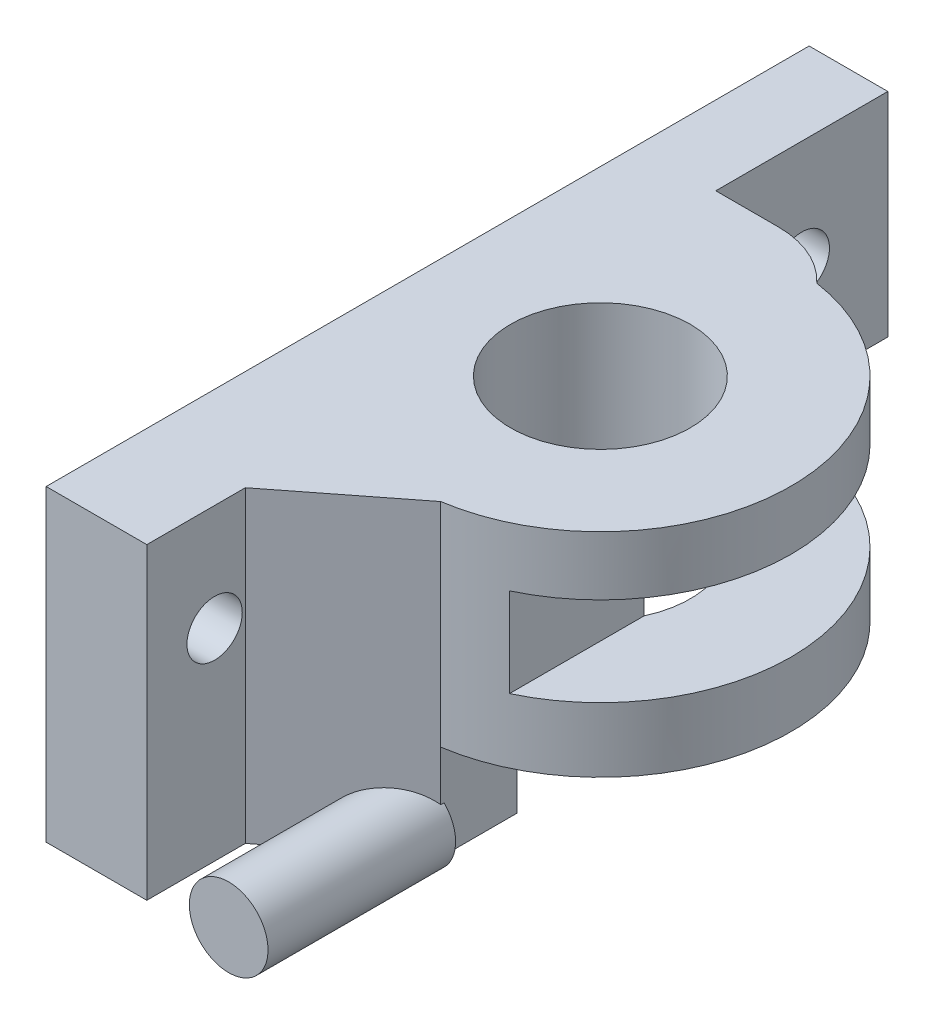
ISO-10303-21;
HEADER;
FILE_DESCRIPTION(('STEP AP214'),'2;1');
FILE_NAME('part.step','',(''),(''),'','','');
FILE_SCHEMA(('AUTOMOTIVE_DESIGN { 1 0 10303 214 1 1 1 1 }'));
ENDSEC;
DATA;
#1=APPLICATION_CONTEXT('core data for automotive mechanical design processes');
#2=APPLICATION_PROTOCOL_DEFINITION('international standard','automotive_design',2000,#1);
#3=PRODUCT_CONTEXT('',#1,'mechanical');
#4=PRODUCT('Part','Part','',(#3));
#5=PRODUCT_RELATED_PRODUCT_CATEGORY('part','',(#4));
#6=PRODUCT_DEFINITION_FORMATION('','',#4);
#7=PRODUCT_DEFINITION_CONTEXT('part definition',#1,'design');
#8=PRODUCT_DEFINITION('design','',#6,#7);
#9=PRODUCT_DEFINITION_SHAPE('','',#8);
#10=(LENGTH_UNIT() NAMED_UNIT(*) SI_UNIT(.MILLI.,.METRE.));
#11=(NAMED_UNIT(*) PLANE_ANGLE_UNIT() SI_UNIT($,.RADIAN.));
#12=(NAMED_UNIT(*) SI_UNIT($,.STERADIAN.) SOLID_ANGLE_UNIT());
#13=UNCERTAINTY_MEASURE_WITH_UNIT(LENGTH_MEASURE(1.E-05),#10,'distance_accuracy_value','');
#14=(GEOMETRIC_REPRESENTATION_CONTEXT(3) GLOBAL_UNCERTAINTY_ASSIGNED_CONTEXT((#13)) GLOBAL_UNIT_ASSIGNED_CONTEXT((#10,
#11,#12)) REPRESENTATION_CONTEXT('',''));
#15=CARTESIAN_POINT('',(0.,0.,0.));
#16=DIRECTION('',(0.,0.,1.));
#17=DIRECTION('',(1.,0.,0.));
#18=AXIS2_PLACEMENT_3D('',#15,#16,#17);
#19=CARTESIAN_POINT('',(-1.39148813039528,-11.785,-34.2));
#20=DIRECTION('',(0.,1.,0.));
#21=DIRECTION('',(0.,0.,1.));
#22=AXIS2_PLACEMENT_3D('',#19,#20,#21);
#23=PLANE('',#22);
#24=CARTESIAN_POINT('',(0.,-11.785,0.));
#25=DIRECTION('',(0.,-1.,0.));
#26=DIRECTION('',(0.,0.,-1.));
#27=AXIS2_PLACEMENT_3D('',#24,#25,#26);
#28=CIRCLE('',#27,9.7);
#29=CARTESIAN_POINT('',(0.,-11.785,-9.7));
#30=VERTEX_POINT('',#29);
#31=EDGE_CURVE('E275',#30,#30,#28,.T.);
#32=ORIENTED_EDGE('',*,*,#31,.F.);
#33=EDGE_LOOP('',(#32));
#34=FACE_BOUND('',#33,.T.);
#35=DIRECTION('',(0.,0.,1.));
#36=VECTOR('',#35,1.);
#37=CARTESIAN_POINT('',(3.10851186960473,-11.785,12.089639111871));
#38=LINE('',#37,#36);
#39=CARTESIAN_POINT('',(3.10851186960473,-11.785,12.089639111871));
#40=VERTEX_POINT('',#39);
#41=CARTESIAN_POINT('',(3.10851186960473,-11.785,20.3539984758898));
#42=VERTEX_POINT('',#41);
#43=EDGE_CURVE('E321',#40,#42,#38,.T.);
#44=ORIENTED_EDGE('',*,*,#43,.F.);
#45=DIRECTION('',(1.,0.,0.));
#46=VECTOR('',#45,1.);
#47=CARTESIAN_POINT('',(-19.6,-11.785,12.089639111871));
#48=LINE('',#47,#46);
#49=CARTESIAN_POINT('',(-19.6,-11.785,12.089639111871));
#50=VERTEX_POINT('',#49);
#51=EDGE_CURVE('E324',#50,#40,#48,.T.);
#52=ORIENTED_EDGE('',*,*,#51,.F.);
#53=DIRECTION('',(0.,0.,1.));
#54=VECTOR('',#53,1.);
#55=CARTESIAN_POINT('',(-19.6,-11.785,-42.1394874741397));
#56=LINE('',#55,#54);
#57=CARTESIAN_POINT('',(-19.6,-11.785,-42.1394874741397));
#58=VERTEX_POINT('',#57);
#59=EDGE_CURVE('E216',#58,#50,#56,.T.);
#60=ORIENTED_EDGE('',*,*,#59,.F.);
#61=DIRECTION('',(1.,0.,0.));
#62=VECTOR('',#61,1.);
#63=CARTESIAN_POINT('',(-14.6,-11.785,-42.1394874741397));
#64=LINE('',#63,#62);
#65=CARTESIAN_POINT('',(-11.1,-11.785,-42.1394874741397));
#66=VERTEX_POINT('',#65);
#67=EDGE_CURVE('E223',#58,#66,#64,.T.);
#68=ORIENTED_EDGE('',*,*,#67,.T.);
#69=DIRECTION('',(0.,0.,1.));
#70=VECTOR('',#69,1.);
#71=CARTESIAN_POINT('',(-11.1,-11.785,-36.510780817625));
#72=LINE('',#71,#70);
#73=CARTESIAN_POINT('',(-11.1,-11.785,-23.5594874741397));
#74=VERTEX_POINT('',#73);
#75=EDGE_CURVE('E233',#66,#74,#72,.T.);
#76=ORIENTED_EDGE('',*,*,#75,.T.);
#77=DIRECTION('',(-1.,0.,0.));
#78=VECTOR('',#77,1.);
#79=CARTESIAN_POINT('',(3.00000000000002,-11.785,-23.5594874741397));
#80=LINE('',#79,#78);
#81=CARTESIAN_POINT('',(-4.32210177975512,-11.785,-23.5594874741397));
#82=VERTEX_POINT('',#81);
#83=EDGE_CURVE('E236',#82,#74,#80,.T.);
#84=ORIENTED_EDGE('',*,*,#83,.F.);
#85=CARTESIAN_POINT('',(-4.32210177975512,-11.785,-13.5594874741397));
#86=DIRECTION('',(0.,1.,0.));
#87=DIRECTION('',(0.,0.,1.));
#88=AXIS2_PLACEMENT_3D('',#85,#86,#87);
#89=CIRCLE('',#88,10.);
#90=CARTESIAN_POINT('',(3.00000000000002,-11.785,-20.3702749122342));
#91=VERTEX_POINT('',#90);
#92=EDGE_CURVE('E229',#82,#91,#89,.F.);
#93=ORIENTED_EDGE('',*,*,#92,.T.);
#94=CARTESIAN_POINT('',(0.,-11.785,0.));
#95=DIRECTION('',(0.,1.,0.));
#96=DIRECTION('',(0.,0.,1.));
#97=AXIS2_PLACEMENT_3D('',#94,#95,#96);
#98=CIRCLE('',#97,20.59);
#99=EDGE_CURVE('E249',#42,#91,#98,.T.);
#100=ORIENTED_EDGE('',*,*,#99,.F.);
#101=EDGE_LOOP('',(#44,#52,#60,#68,#76,#84,#93,#100));
#102=FACE_BOUND('',#101,.T.);
#103=ADVANCED_FACE('F55',(#34,#102),#23,.F.);
#104=CARTESIAN_POINT('',(0.,-55.2,0.));
#105=DIRECTION('',(0.,1.,0.));
#106=DIRECTION('',(0.,0.,1.));
#107=AXIS2_PLACEMENT_3D('',#104,#105,#106);
#108=CYLINDRICAL_SURFACE('',#107,20.59);
#109=CARTESIAN_POINT('',(0.,4.80402203282774,0.));
#110=DIRECTION('',(0.,1.,0.));
#111=DIRECTION('',(0.,0.,1.));
#112=AXIS2_PLACEMENT_3D('',#109,#110,#111);
#113=CIRCLE('',#112,20.59);
#114=CARTESIAN_POINT('',(8.80000000000003,4.80402203282774,18.6147280399151));
#115=VERTEX_POINT('',#114);
#116=CARTESIAN_POINT('',(8.80000000000003,4.80402203282774,-18.6147280399151));
#117=VERTEX_POINT('',#116);
#118=EDGE_CURVE('E254',#115,#117,#113,.T.);
#119=ORIENTED_EDGE('',*,*,#118,.T.);
#120=DIRECTION('',(0.,1.,0.));
#121=VECTOR('',#120,1.);
#122=CARTESIAN_POINT('',(8.80000000000003,-55.2,-18.614728039915));
#123=LINE('',#122,#121);
#124=CARTESIAN_POINT('',(8.80000000000003,-4.80402203282774,-18.614728039915));
#125=VERTEX_POINT('',#124);
#126=EDGE_CURVE('E255',#125,#117,#123,.T.);
#127=ORIENTED_EDGE('',*,*,#126,.F.);
#128=CARTESIAN_POINT('',(0.,-4.80402203282775,0.));
#129=DIRECTION('',(0.,-1.,0.));
#130=DIRECTION('',(0.,0.,-1.));
#131=AXIS2_PLACEMENT_3D('',#128,#129,#130);
#132=CIRCLE('',#131,20.59);
#133=CARTESIAN_POINT('',(8.80000000000003,-4.80402203282774,18.614728039915));
#134=VERTEX_POINT('',#133);
#135=EDGE_CURVE('E251',#125,#134,#132,.T.);
#136=ORIENTED_EDGE('',*,*,#135,.T.);
#137=DIRECTION('',(0.,1.,0.));
#138=VECTOR('',#137,1.);
#139=CARTESIAN_POINT('',(8.80000000000003,-55.2,18.614728039915));
#140=LINE('',#139,#138);
#141=EDGE_CURVE('E258',#115,#134,#140,.F.);
#142=ORIENTED_EDGE('',*,*,#141,.F.);
#143=EDGE_LOOP('',(#119,#127,#136,#142));
#144=FACE_BOUND('',#143,.T.);
#145=DIRECTION('',(0.,1.,0.));
#146=VECTOR('',#145,1.);
#147=CARTESIAN_POINT('',(3.10851186960473,-55.2,20.3539984758898));
#148=LINE('',#147,#146);
#149=CARTESIAN_POINT('',(3.10851186960473,11.1805911601393,20.3539984758898));
#150=VERTEX_POINT('',#149);
#151=EDGE_CURVE('E243',#42,#150,#148,.T.);
#152=ORIENTED_EDGE('',*,*,#151,.F.);
#153=ORIENTED_EDGE('',*,*,#99,.T.);
#154=DIRECTION('',(0.,1.,0.));
#155=VECTOR('',#154,1.);
#156=CARTESIAN_POINT('',(3.00000000000003,-55.2,-20.3702749122342));
#157=LINE('',#156,#155);
#158=CARTESIAN_POINT('',(3.00000000000002,11.1805911601393,-20.3702749122343));
#159=VERTEX_POINT('',#158);
#160=EDGE_CURVE('E248',#91,#159,#157,.T.);
#161=ORIENTED_EDGE('',*,*,#160,.T.);
#162=CARTESIAN_POINT('',(0.,11.1805911601393,0.));
#163=DIRECTION('',(0.,-1.,0.));
#164=DIRECTION('',(0.,0.,-1.));
#165=AXIS2_PLACEMENT_3D('',#162,#163,#164);
#166=CIRCLE('',#165,20.59);
#167=EDGE_CURVE('E244',#159,#150,#166,.T.);
#168=ORIENTED_EDGE('',*,*,#167,.T.);
#169=EDGE_LOOP('',(#152,#153,#161,#168));
#170=FACE_BOUND('',#169,.T.);
#171=ADVANCED_FACE('F345',(#144,#170),#108,.T.);
#172=CARTESIAN_POINT('',(-16.2413436660295,11.1805911601393,-36.1));
#173=DIRECTION('',(0.,-1.,0.));
#174=DIRECTION('',(0.,0.,-1.));
#175=AXIS2_PLACEMENT_3D('',#172,#173,#174);
#176=PLANE('',#175);
#177=DIRECTION('',(0.,0.,-1.));
#178=VECTOR('',#177,1.);
#179=CARTESIAN_POINT('',(-19.6,11.1805911601393,-42.1394874741397));
#180=LINE('',#179,#178);
#181=CARTESIAN_POINT('',(-19.6,11.1805911601393,40.2493796193678));
#182=VERTEX_POINT('',#181);
#183=CARTESIAN_POINT('',(-19.6,11.1805911601393,-42.1394874741397));
#184=VERTEX_POINT('',#183);
#185=EDGE_CURVE('E192',#182,#184,#180,.T.);
#186=ORIENTED_EDGE('',*,*,#185,.F.);
#187=DIRECTION('',(-1.,0.,0.));
#188=VECTOR('',#187,1.);
#189=CARTESIAN_POINT('',(-21.4609176370796,11.1805911601393,40.2493796193678));
#190=LINE('',#189,#188);
#191=CARTESIAN_POINT('',(-8.73055199367073,11.1805911601393,40.2493796193678));
#192=VERTEX_POINT('',#191);
#193=EDGE_CURVE('E178',#192,#182,#190,.T.);
#194=ORIENTED_EDGE('',*,*,#193,.F.);
#195=DIRECTION('',(0.,0.,1.));
#196=VECTOR('',#195,1.);
#197=CARTESIAN_POINT('',(-8.73055199367072,11.1805911601393,29.6073390992279));
#198=LINE('',#197,#196);
#199=CARTESIAN_POINT('',(-8.73055199367072,11.1805911601393,29.6073390992279));
#200=VERTEX_POINT('',#199);
#201=EDGE_CURVE('E190',#200,#192,#198,.T.);
#202=ORIENTED_EDGE('',*,*,#201,.F.);
#203=DIRECTION('',(-0.787892886320469,0.,0.615812308813003));
#204=VECTOR('',#203,1.);
#205=CARTESIAN_POINT('',(3.10851186960473,11.1805911601393,20.3539984758898));
#206=LINE('',#205,#204);
#207=EDGE_CURVE('E199',#150,#200,#206,.T.);
#208=ORIENTED_EDGE('',*,*,#207,.F.);
#209=ORIENTED_EDGE('',*,*,#167,.F.);
#210=CARTESIAN_POINT('',(-4.32210177975512,11.1805911601393,-13.5594874741397));
#211=DIRECTION('',(0.,-1.,0.));
#212=DIRECTION('',(0.,0.,-1.));
#213=AXIS2_PLACEMENT_3D('',#210,#211,#212);
#214=CIRCLE('',#213,10.);
#215=CARTESIAN_POINT('',(-4.32210177975512,11.1805911601393,-23.5594874741397));
#216=VERTEX_POINT('',#215);
#217=EDGE_CURVE('E228',#159,#216,#214,.F.);
#218=ORIENTED_EDGE('',*,*,#217,.T.);
#219=DIRECTION('',(1.,0.,0.));
#220=VECTOR('',#219,1.);
#221=CARTESIAN_POINT('',(-16.1,11.1805911601393,-23.5594874741397));
#222=LINE('',#221,#220);
#223=CARTESIAN_POINT('',(-11.1,11.1805911601393,-23.5594874741397));
#224=VERTEX_POINT('',#223);
#225=EDGE_CURVE('E237',#224,#216,#222,.T.);
#226=ORIENTED_EDGE('',*,*,#225,.F.);
#227=DIRECTION('',(0.,0.,-1.));
#228=VECTOR('',#227,1.);
#229=CARTESIAN_POINT('',(-11.1,11.1805911601393,-42.1394874741397));
#230=LINE('',#229,#228);
#231=CARTESIAN_POINT('',(-11.1,11.1805911601393,-42.1394874741397));
#232=VERTEX_POINT('',#231);
#233=EDGE_CURVE('E221',#224,#232,#230,.T.);
#234=ORIENTED_EDGE('',*,*,#233,.T.);
#235=DIRECTION('',(-1.,0.,0.));
#236=VECTOR('',#235,1.);
#237=CARTESIAN_POINT('',(-14.6,11.1805911601393,-42.1394874741397));
#238=LINE('',#237,#236);
#239=EDGE_CURVE('E290',#232,#184,#238,.T.);
#240=ORIENTED_EDGE('',*,*,#239,.T.);
#241=EDGE_LOOP('',(#186,#194,#202,#208,#209,#218,#226,#234,#240));
#242=FACE_BOUND('',#241,.T.);
#243=CARTESIAN_POINT('',(0.,11.1805911601393,0.));
#244=DIRECTION('',(0.,-1.,0.));
#245=DIRECTION('',(0.,0.,-1.));
#246=AXIS2_PLACEMENT_3D('',#243,#244,#245);
#247=CIRCLE('',#246,9.7);
#248=CARTESIAN_POINT('',(0.,11.1805911601393,-9.7));
#249=VERTEX_POINT('',#248);
#250=EDGE_CURVE('E239',#249,#249,#247,.T.);
#251=ORIENTED_EDGE('',*,*,#250,.T.);
#252=EDGE_LOOP('',(#251));
#253=FACE_BOUND('',#252,.T.);
#254=ADVANCED_FACE('F57',(#242,#253),#176,.F.);
#255=CARTESIAN_POINT('',(8.80000000000003,4.80402203282774,22.440347469412));
#256=DIRECTION('',(0.,1.,0.));
#257=DIRECTION('',(0.,0.,1.));
#258=AXIS2_PLACEMENT_3D('',#255,#256,#257);
#259=PLANE('',#258);
#260=ORIENTED_EDGE('',*,*,#118,.F.);
#261=DIRECTION('',(0.,0.,1.));
#262=VECTOR('',#261,1.);
#263=CARTESIAN_POINT('',(8.80000000000003,4.80402203282774,22.440347469412));
#264=LINE('',#263,#262);
#265=CARTESIAN_POINT('',(8.80000000000003,4.80402203282774,4.08044115262057));
#266=VERTEX_POINT('',#265);
#267=EDGE_CURVE('E261',#266,#115,#264,.T.);
#268=ORIENTED_EDGE('',*,*,#267,.F.);
#269=CARTESIAN_POINT('',(0.,4.80402203282774,0.));
#270=DIRECTION('',(0.,1.,0.));
#271=DIRECTION('',(0.,0.,1.));
#272=AXIS2_PLACEMENT_3D('',#269,#270,#271);
#273=CIRCLE('',#272,9.7);
#274=CARTESIAN_POINT('',(8.80000000000003,4.80402203282774,-4.08044115262056));
#275=VERTEX_POINT('',#274);
#276=EDGE_CURVE('E232',#266,#275,#273,.T.);
#277=ORIENTED_EDGE('',*,*,#276,.T.);
#278=EDGE_CURVE('E257',#117,#275,#264,.T.);
#279=ORIENTED_EDGE('',*,*,#278,.F.);
#280=EDGE_LOOP('',(#260,#268,#277,#279));
#281=FACE_BOUND('',#280,.T.);
#282=ADVANCED_FACE('F416',(#281),#259,.F.);
#283=CARTESIAN_POINT('',(8.80000000000003,0.,0.));
#284=DIRECTION('',(1.,0.,0.));
#285=DIRECTION('',(0.,0.,-1.));
#286=AXIS2_PLACEMENT_3D('',#283,#284,#285);
#287=PLANE('',#286);
#288=ORIENTED_EDGE('',*,*,#126,.T.);
#289=ORIENTED_EDGE('',*,*,#278,.T.);
#290=DIRECTION('',(0.,-1.,0.));
#291=VECTOR('',#290,1.);
#292=CARTESIAN_POINT('',(8.80000000000003,11.1805911601393,-4.08044115262056));
#293=LINE('',#292,#291);
#294=CARTESIAN_POINT('',(8.80000000000003,-4.80402203282775,-4.08044115262056));
#295=VERTEX_POINT('',#294);
#296=EDGE_CURVE('E266',#295,#275,#293,.F.);
#297=ORIENTED_EDGE('',*,*,#296,.F.);
#298=DIRECTION('',(0.,0.,-1.));
#299=VECTOR('',#298,1.);
#300=CARTESIAN_POINT('',(8.80000000000003,-4.80402203282774,22.440347469412));
#301=LINE('',#300,#299);
#302=EDGE_CURVE('E262',#295,#125,#301,.T.);
#303=ORIENTED_EDGE('',*,*,#302,.T.);
#304=EDGE_LOOP('',(#288,#289,#297,#303));
#305=FACE_BOUND('',#304,.T.);
#306=ADVANCED_FACE('F412',(#305),#287,.T.);
#307=ORIENTED_EDGE('',*,*,#267,.T.);
#308=ORIENTED_EDGE('',*,*,#141,.T.);
#309=CARTESIAN_POINT('',(8.80000000000003,-4.80402203282774,4.08044115262056));
#310=VERTEX_POINT('',#309);
#311=EDGE_CURVE('E260',#134,#310,#301,.T.);
#312=ORIENTED_EDGE('',*,*,#311,.T.);
#313=DIRECTION('',(0.,-1.,0.));
#314=VECTOR('',#313,1.);
#315=CARTESIAN_POINT('',(8.80000000000003,11.1805911601393,4.08044115262056));
#316=LINE('',#315,#314);
#317=EDGE_CURVE('E269',#266,#310,#316,.T.);
#318=ORIENTED_EDGE('',*,*,#317,.F.);
#319=EDGE_LOOP('',(#307,#308,#312,#318));
#320=FACE_BOUND('',#319,.T.);
#321=ADVANCED_FACE('F415',(#320),#287,.T.);
#322=CARTESIAN_POINT('',(8.80000000000003,-4.80402203282774,22.440347469412));
#323=DIRECTION('',(0.,-1.,0.));
#324=DIRECTION('',(0.,0.,-1.));
#325=AXIS2_PLACEMENT_3D('',#322,#323,#324);
#326=PLANE('',#325);
#327=ORIENTED_EDGE('',*,*,#302,.F.);
#328=CARTESIAN_POINT('',(0.,-4.80402203282775,0.));
#329=DIRECTION('',(0.,-1.,0.));
#330=DIRECTION('',(0.,0.,-1.));
#331=AXIS2_PLACEMENT_3D('',#328,#329,#330);
#332=CIRCLE('',#331,9.7);
#333=EDGE_CURVE('E247',#295,#310,#332,.T.);
#334=ORIENTED_EDGE('',*,*,#333,.T.);
#335=ORIENTED_EDGE('',*,*,#311,.F.);
#336=ORIENTED_EDGE('',*,*,#135,.F.);
#337=EDGE_LOOP('',(#327,#334,#335,#336));
#338=FACE_BOUND('',#337,.T.);
#339=ADVANCED_FACE('F410',(#338),#326,.F.);
#340=CARTESIAN_POINT('',(0.,11.1805911601393,0.));
#341=DIRECTION('',(0.,-1.,0.));
#342=DIRECTION('',(0.,0.,-1.));
#343=AXIS2_PLACEMENT_3D('',#340,#341,#342);
#344=CYLINDRICAL_SURFACE('',#343,9.7);
#345=ORIENTED_EDGE('',*,*,#296,.T.);
#346=ORIENTED_EDGE('',*,*,#276,.F.);
#347=ORIENTED_EDGE('',*,*,#317,.T.);
#348=ORIENTED_EDGE('',*,*,#333,.F.);
#349=EDGE_LOOP('',(#345,#346,#347,#348));
#350=FACE_BOUND('',#349,.T.);
#351=ORIENTED_EDGE('',*,*,#250,.F.);
#352=EDGE_LOOP('',(#351));
#353=FACE_BOUND('',#352,.T.);
#354=ORIENTED_EDGE('',*,*,#31,.T.);
#355=EDGE_LOOP('',(#354));
#356=FACE_BOUND('',#355,.T.);
#357=ADVANCED_FACE('F407',(#350,#353,#356),#344,.F.);
#358=CARTESIAN_POINT('',(3.00000000000002,-11.785,-23.5594874741397));
#359=DIRECTION('',(0.,0.,1.));
#360=DIRECTION('',(1.,0.,0.));
#361=AXIS2_PLACEMENT_3D('',#358,#359,#360);
#362=PLANE('',#361);
#363=ORIENTED_EDGE('',*,*,#225,.T.);
#364=DIRECTION('',(0.,1.,0.));
#365=VECTOR('',#364,1.);
#366=CARTESIAN_POINT('',(-4.32210177975512,-11.785,-23.5594874741397));
#367=LINE('',#366,#365);
#368=EDGE_CURVE('E234',#216,#82,#367,.F.);
#369=ORIENTED_EDGE('',*,*,#368,.T.);
#370=ORIENTED_EDGE('',*,*,#83,.T.);
#371=DIRECTION('',(0.,1.,0.));
#372=VECTOR('',#371,1.);
#373=CARTESIAN_POINT('',(-11.1,-11.785,-23.5594874741397));
#374=LINE('',#373,#372);
#375=EDGE_CURVE('E240',#74,#224,#374,.T.);
#376=ORIENTED_EDGE('',*,*,#375,.T.);
#377=EDGE_LOOP('',(#363,#369,#370,#376));
#378=FACE_BOUND('',#377,.T.);
#379=ADVANCED_FACE('F369',(#378),#362,.F.);
#380=CARTESIAN_POINT('',(-11.1,11.1805911601393,-36.510780817625));
#381=DIRECTION('',(1.,0.,0.));
#382=DIRECTION('',(0.,0.,-1.));
#383=AXIS2_PLACEMENT_3D('',#380,#381,#382);
#384=PLANE('',#383);
#385=CARTESIAN_POINT('',(-11.1,-0.302204419938334,-32.8494874741397));
#386=DIRECTION('',(1.,0.,0.));
#387=DIRECTION('',(0.,0.,-1.));
#388=AXIS2_PLACEMENT_3D('',#385,#386,#387);
#389=CIRCLE('',#388,2.98499999999359);
#390=CARTESIAN_POINT('',(-11.1,-0.302204419938334,-35.8344874741333));
#391=VERTEX_POINT('',#390);
#392=EDGE_CURVE('E220',#391,#391,#389,.T.);
#393=ORIENTED_EDGE('',*,*,#392,.F.);
#394=EDGE_LOOP('',(#393));
#395=FACE_BOUND('',#394,.T.);
#396=ORIENTED_EDGE('',*,*,#233,.F.);
#397=ORIENTED_EDGE('',*,*,#375,.F.);
#398=ORIENTED_EDGE('',*,*,#75,.F.);
#399=DIRECTION('',(0.,-1.,0.));
#400=VECTOR('',#399,1.);
#401=CARTESIAN_POINT('',(-11.1,11.315,-42.1394874741397));
#402=LINE('',#401,#400);
#403=EDGE_CURVE('E226',#232,#66,#402,.T.);
#404=ORIENTED_EDGE('',*,*,#403,.F.);
#405=EDGE_LOOP('',(#396,#397,#398,#404));
#406=FACE_BOUND('',#405,.T.);
#407=ADVANCED_FACE('F371',(#395,#406),#384,.T.);
#408=CARTESIAN_POINT('',(-4.32210177975512,-55.2,-13.5594874741397));
#409=DIRECTION('',(0.,1.,0.));
#410=DIRECTION('',(0.,0.,1.));
#411=AXIS2_PLACEMENT_3D('',#408,#409,#410);
#412=CYLINDRICAL_SURFACE('',#411,10.);
#413=ORIENTED_EDGE('',*,*,#92,.F.);
#414=ORIENTED_EDGE('',*,*,#368,.F.);
#415=ORIENTED_EDGE('',*,*,#217,.F.);
#416=ORIENTED_EDGE('',*,*,#160,.F.);
#417=EDGE_LOOP('',(#413,#414,#415,#416));
#418=FACE_BOUND('',#417,.T.);
#419=ADVANCED_FACE('F374',(#418),#412,.T.);
#420=CARTESIAN_POINT('',(-14.6,11.315,-42.1394874741397));
#421=DIRECTION('',(0.,0.,-1.));
#422=DIRECTION('',(-1.,0.,0.));
#423=AXIS2_PLACEMENT_3D('',#420,#421,#422);
#424=PLANE('',#423);
#425=ORIENTED_EDGE('',*,*,#239,.F.);
#426=ORIENTED_EDGE('',*,*,#403,.T.);
#427=ORIENTED_EDGE('',*,*,#67,.F.);
#428=DIRECTION('',(0.,-1.,0.));
#429=VECTOR('',#428,1.);
#430=CARTESIAN_POINT('',(-19.6,-11.785,-42.1394874741397));
#431=LINE('',#430,#429);
#432=EDGE_CURVE('E213',#184,#58,#431,.T.);
#433=ORIENTED_EDGE('',*,*,#432,.F.);
#434=EDGE_LOOP('',(#425,#426,#427,#433));
#435=FACE_BOUND('',#434,.T.);
#436=ADVANCED_FACE('F363',(#435),#424,.T.);
#437=CARTESIAN_POINT('',(-34.0914881303953,-0.302204419930327,32.9286686363162));
#438=DIRECTION('',(1.,0.,0.));
#439=DIRECTION('',(0.,0.,-1.));
#440=AXIS2_PLACEMENT_3D('',#437,#438,#439);
#441=CYLINDRICAL_SURFACE('',#440,2.985);
#442=CARTESIAN_POINT('',(-8.73055199367072,-0.302204419930327,32.9286686363162));
#443=DIRECTION('',(-1.,0.,0.));
#444=DIRECTION('',(0.,0.,1.));
#445=AXIS2_PLACEMENT_3D('',#442,#443,#444);
#446=CIRCLE('',#445,2.985);
#447=CARTESIAN_POINT('',(-8.73055199367072,-0.302204419930327,35.9136686363162));
#448=VERTEX_POINT('',#447);
#449=EDGE_CURVE('E201',#448,#448,#446,.F.);
#450=ORIENTED_EDGE('',*,*,#449,.T.);
#451=EDGE_LOOP('',(#450));
#452=FACE_BOUND('',#451,.T.);
#453=CARTESIAN_POINT('',(-19.6,-0.302204419930327,32.9286686363162));
#454=DIRECTION('',(1.,0.,0.));
#455=DIRECTION('',(0.,0.,-1.));
#456=AXIS2_PLACEMENT_3D('',#453,#454,#455);
#457=CIRCLE('',#456,2.98499999999392);
#458=CARTESIAN_POINT('',(-19.6,-0.302204419930327,29.9436686363222));
#459=VERTEX_POINT('',#458);
#460=EDGE_CURVE('E207',#459,#459,#457,.T.);
#461=ORIENTED_EDGE('',*,*,#460,.F.);
#462=EDGE_LOOP('',(#461));
#463=FACE_BOUND('',#462,.T.);
#464=ADVANCED_FACE('F428',(#452,#463),#441,.F.);
#465=CARTESIAN_POINT('',(-34.0914881303953,-0.302204419938334,-32.8494874741397));
#466=DIRECTION('',(1.,0.,0.));
#467=DIRECTION('',(0.,0.,-1.));
#468=AXIS2_PLACEMENT_3D('',#465,#466,#467);
#469=CYLINDRICAL_SURFACE('',#468,2.98499999999359);
#470=ORIENTED_EDGE('',*,*,#392,.T.);
#471=EDGE_LOOP('',(#470));
#472=FACE_BOUND('',#471,.T.);
#473=CARTESIAN_POINT('',(-19.6,-0.302204419938334,-32.8494874741397));
#474=DIRECTION('',(1.,0.,0.));
#475=DIRECTION('',(0.,0.,-1.));
#476=AXIS2_PLACEMENT_3D('',#473,#474,#475);
#477=CIRCLE('',#476,2.98499999999359);
#478=CARTESIAN_POINT('',(-19.6,-0.302204419938334,-35.8344874741333));
#479=VERTEX_POINT('',#478);
#480=EDGE_CURVE('E210',#479,#479,#477,.T.);
#481=ORIENTED_EDGE('',*,*,#480,.F.);
#482=EDGE_LOOP('',(#481));
#483=FACE_BOUND('',#482,.T.);
#484=ADVANCED_FACE('F431',(#472,#483),#469,.F.);
#485=CARTESIAN_POINT('',(-19.6,0.,0.));
#486=DIRECTION('',(1.,0.,0.));
#487=DIRECTION('',(0.,0.,-1.));
#488=AXIS2_PLACEMENT_3D('',#485,#486,#487);
#489=PLANE('',#488);
#490=ORIENTED_EDGE('',*,*,#460,.T.);
#491=EDGE_LOOP('',(#490));
#492=FACE_BOUND('',#491,.T.);
#493=ORIENTED_EDGE('',*,*,#480,.T.);
#494=EDGE_LOOP('',(#493));
#495=FACE_BOUND('',#494,.T.);
#496=DIRECTION('',(0.,0.,-1.));
#497=VECTOR('',#496,1.);
#498=CARTESIAN_POINT('',(-19.6,-22.085,42.140780817625));
#499=LINE('',#498,#497);
#500=CARTESIAN_POINT('',(-19.6,-22.085,40.2493796193678));
#501=VERTEX_POINT('',#500);
#502=CARTESIAN_POINT('',(-19.6,-22.085,12.089639111871));
#503=VERTEX_POINT('',#502);
#504=EDGE_CURVE('E328',#501,#503,#499,.T.);
#505=ORIENTED_EDGE('',*,*,#504,.F.);
#506=DIRECTION('',(0.,1.,0.));
#507=VECTOR('',#506,1.);
#508=CARTESIAN_POINT('',(-19.6,0.,40.2493796193678));
#509=LINE('',#508,#507);
#510=EDGE_CURVE('E71',#501,#182,#509,.T.);
#511=ORIENTED_EDGE('',*,*,#510,.T.);
#512=ORIENTED_EDGE('',*,*,#185,.T.);
#513=ORIENTED_EDGE('',*,*,#432,.T.);
#514=ORIENTED_EDGE('',*,*,#59,.T.);
#515=DIRECTION('',(0.,1.,0.));
#516=VECTOR('',#515,1.);
#517=CARTESIAN_POINT('',(-19.6,-22.085,12.089639111871));
#518=LINE('',#517,#516);
#519=EDGE_CURVE('E338',#503,#50,#518,.T.);
#520=ORIENTED_EDGE('',*,*,#519,.F.);
#521=EDGE_LOOP('',(#505,#511,#512,#513,#514,#520));
#522=FACE_BOUND('',#521,.T.);
#523=ADVANCED_FACE('F359',(#492,#495,#522),#489,.F.);
#524=CARTESIAN_POINT('',(-8.73055199367072,-11.785,29.6073390992279));
#525=DIRECTION('',(-1.,0.,0.));
#526=DIRECTION('',(0.,0.,1.));
#527=AXIS2_PLACEMENT_3D('',#524,#525,#526);
#528=PLANE('',#527);
#529=ORIENTED_EDGE('',*,*,#201,.T.);
#530=DIRECTION('',(0.,-1.,0.));
#531=VECTOR('',#530,1.);
#532=CARTESIAN_POINT('',(-8.73055199367073,-11.785,40.2493796193678));
#533=LINE('',#532,#531);
#534=CARTESIAN_POINT('',(-8.73055199367072,-22.085,40.2493796193678));
#535=VERTEX_POINT('',#534);
#536=EDGE_CURVE('E175',#192,#535,#533,.T.);
#537=ORIENTED_EDGE('',*,*,#536,.T.);
#538=DIRECTION('',(0.,0.,1.));
#539=VECTOR('',#538,1.);
#540=CARTESIAN_POINT('',(-8.73055199367072,-22.085,29.6073390992279));
#541=LINE('',#540,#539);
#542=CARTESIAN_POINT('',(-8.73055199367072,-22.085,29.6073390992279));
#543=VERTEX_POINT('',#542);
#544=EDGE_CURVE('E326',#543,#535,#541,.T.);
#545=ORIENTED_EDGE('',*,*,#544,.F.);
#546=DIRECTION('',(0.,1.,0.));
#547=VECTOR('',#546,1.);
#548=CARTESIAN_POINT('',(-8.73055199367072,-11.785,29.6073390992279));
#549=LINE('',#548,#547);
#550=EDGE_CURVE('E197',#543,#200,#549,.T.);
#551=ORIENTED_EDGE('',*,*,#550,.T.);
#552=EDGE_LOOP('',(#529,#537,#545,#551));
#553=FACE_BOUND('',#552,.T.);
#554=ORIENTED_EDGE('',*,*,#449,.F.);
#555=EDGE_LOOP('',(#554));
#556=FACE_BOUND('',#555,.T.);
#557=ADVANCED_FACE('F194',(#553,#556),#528,.F.);
#558=CARTESIAN_POINT('',(3.10851186960473,-11.785,20.3539984758898));
#559=DIRECTION('',(-0.615812308813003,0.,-0.787892886320469));
#560=DIRECTION('',(-0.787892886320469,0.,0.615812308813003));
#561=AXIS2_PLACEMENT_3D('',#558,#559,#560);
#562=PLANE('',#561);
#563=DIRECTION('',(-0.787892886320469,0.,0.615812308813003));
#564=VECTOR('',#563,1.);
#565=CARTESIAN_POINT('',(3.10851186960473,-22.085,20.3539984758898));
#566=LINE('',#565,#564);
#567=CARTESIAN_POINT('',(-3.69313251144934,-22.085,25.6701225363351));
#568=VERTEX_POINT('',#567);
#569=EDGE_CURVE('E323',#568,#543,#566,.T.);
#570=ORIENTED_EDGE('',*,*,#569,.F.);
#571=CARTESIAN_POINT('',(0.10851186960473,-20.185,22.6987803092006));
#572=DIRECTION('',(-0.615812308813003,0.,-0.787892886320469));
#573=DIRECTION('',(-0.787892886320469,0.,0.615812308813003));
#574=AXIS2_PLACEMENT_3D('',#571,#572,#573);
#575=ELLIPSE('',#574,5.39413424564332,4.25);
#576=CARTESIAN_POINT('',(3.10851186960473,-17.1746013553019,20.3539984758898));
#577=VERTEX_POINT('',#576);
#578=EDGE_CURVE('E313',#568,#577,#575,.T.);
#579=ORIENTED_EDGE('',*,*,#578,.T.);
#580=DIRECTION('',(0.,1.,0.));
#581=VECTOR('',#580,1.);
#582=CARTESIAN_POINT('',(3.10851186960473,-22.085,20.3539984758898));
#583=LINE('',#582,#581);
#584=EDGE_CURVE('E203',#577,#42,#583,.T.);
#585=ORIENTED_EDGE('',*,*,#584,.T.);
#586=ORIENTED_EDGE('',*,*,#151,.T.);
#587=ORIENTED_EDGE('',*,*,#207,.T.);
#588=ORIENTED_EDGE('',*,*,#550,.F.);
#589=EDGE_LOOP('',(#570,#579,#585,#586,#587,#588));
#590=FACE_BOUND('',#589,.T.);
#591=ADVANCED_FACE('F342',(#590),#562,.F.);
#592=CARTESIAN_POINT('',(3.10851186960473,-22.085,12.089639111871));
#593=DIRECTION('',(-1.,0.,0.));
#594=DIRECTION('',(0.,0.,1.));
#595=AXIS2_PLACEMENT_3D('',#592,#593,#594);
#596=PLANE('',#595);
#597=ORIENTED_EDGE('',*,*,#584,.F.);
#598=DIRECTION('',(0.,0.,1.));
#599=VECTOR('',#598,1.);
#600=CARTESIAN_POINT('',(3.10851186960473,-17.1746013553019,19.99));
#601=LINE('',#600,#599);
#602=CARTESIAN_POINT('',(3.10851186960473,-17.1746013553019,19.99));
#603=VERTEX_POINT('',#602);
#604=EDGE_CURVE('E312',#577,#603,#601,.F.);
#605=ORIENTED_EDGE('',*,*,#604,.T.);
#606=DIRECTION('',(0.,1.,0.));
#607=VECTOR('',#606,1.);
#608=CARTESIAN_POINT('',(3.10851186960473,-22.085,19.99));
#609=LINE('',#608,#607);
#610=CARTESIAN_POINT('',(3.10851186960473,-22.085,19.99));
#611=VERTEX_POINT('',#610);
#612=EDGE_CURVE('E306',#611,#603,#609,.T.);
#613=ORIENTED_EDGE('',*,*,#612,.F.);
#614=DIRECTION('',(0.,0.,1.));
#615=VECTOR('',#614,1.);
#616=CARTESIAN_POINT('',(3.10851186960473,-22.085,12.089639111871));
#617=LINE('',#616,#615);
#618=CARTESIAN_POINT('',(3.10851186960473,-22.085,12.089639111871));
#619=VERTEX_POINT('',#618);
#620=EDGE_CURVE('E303',#619,#611,#617,.T.);
#621=ORIENTED_EDGE('',*,*,#620,.F.);
#622=DIRECTION('',(0.,1.,0.));
#623=VECTOR('',#622,1.);
#624=CARTESIAN_POINT('',(3.10851186960473,-22.085,12.089639111871));
#625=LINE('',#624,#623);
#626=EDGE_CURVE('E332',#619,#40,#625,.T.);
#627=ORIENTED_EDGE('',*,*,#626,.T.);
#628=ORIENTED_EDGE('',*,*,#43,.T.);
#629=EDGE_LOOP('',(#597,#605,#613,#621,#627,#628));
#630=FACE_BOUND('',#629,.T.);
#631=ADVANCED_FACE('F310',(#630),#596,.F.);
#632=CARTESIAN_POINT('',(-19.6,-22.085,12.089639111871));
#633=DIRECTION('',(0.,0.,1.));
#634=DIRECTION('',(1.,0.,0.));
#635=AXIS2_PLACEMENT_3D('',#632,#633,#634);
#636=PLANE('',#635);
#637=ORIENTED_EDGE('',*,*,#51,.T.);
#638=ORIENTED_EDGE('',*,*,#626,.F.);
#639=DIRECTION('',(1.,0.,0.));
#640=VECTOR('',#639,1.);
#641=CARTESIAN_POINT('',(-19.6,-22.085,12.089639111871));
#642=LINE('',#641,#640);
#643=EDGE_CURVE('E330',#503,#619,#642,.T.);
#644=ORIENTED_EDGE('',*,*,#643,.F.);
#645=ORIENTED_EDGE('',*,*,#519,.T.);
#646=EDGE_LOOP('',(#637,#638,#644,#645));
#647=FACE_BOUND('',#646,.T.);
#648=ADVANCED_FACE('F354',(#647),#636,.F.);
#649=CARTESIAN_POINT('',(0.,-22.085,0.));
#650=DIRECTION('',(0.,-1.,0.));
#651=DIRECTION('',(0.,0.,-1.));
#652=AXIS2_PLACEMENT_3D('',#649,#650,#651);
#653=PLANE('',#652);
#654=DIRECTION('',(1.,0.,0.));
#655=VECTOR('',#654,1.);
#656=CARTESIAN_POINT('',(0.,-22.085,40.2493796193678));
#657=LINE('',#656,#655);
#658=EDGE_CURVE('E179',#501,#535,#657,.T.);
#659=ORIENTED_EDGE('',*,*,#658,.F.);
#660=ORIENTED_EDGE('',*,*,#504,.T.);
#661=ORIENTED_EDGE('',*,*,#643,.T.);
#662=ORIENTED_EDGE('',*,*,#620,.T.);
#663=DIRECTION('',(-1.,0.,0.));
#664=VECTOR('',#663,1.);
#665=CARTESIAN_POINT('',(0.,-22.085,19.99));
#666=LINE('',#665,#664);
#667=CARTESIAN_POINT('',(-3.69313251144934,-22.085,19.99));
#668=VERTEX_POINT('',#667);
#669=EDGE_CURVE('E64',#611,#668,#666,.T.);
#670=ORIENTED_EDGE('',*,*,#669,.T.);
#671=DIRECTION('',(0.,0.,1.));
#672=VECTOR('',#671,1.);
#673=CARTESIAN_POINT('',(-3.69313251144934,-22.085,19.99));
#674=LINE('',#673,#672);
#675=EDGE_CURVE('E12',#568,#668,#674,.F.);
#676=ORIENTED_EDGE('',*,*,#675,.F.);
#677=ORIENTED_EDGE('',*,*,#569,.T.);
#678=ORIENTED_EDGE('',*,*,#544,.T.);
#679=EDGE_LOOP('',(#659,#660,#661,#662,#670,#676,#677,#678));
#680=FACE_BOUND('',#679,.T.);
#681=ADVANCED_FACE('F300',(#680),#653,.T.);
#682=CARTESIAN_POINT('',(0.10851186960473,-20.185,19.99));
#683=DIRECTION('',(0.,0.,1.));
#684=DIRECTION('',(1.,0.,0.));
#685=AXIS2_PLACEMENT_3D('',#682,#683,#684);
#686=CYLINDRICAL_SURFACE('',#685,4.25);
#687=CARTESIAN_POINT('',(0.10851186960473,-20.185,40.2493796193678));
#688=DIRECTION('',(0.,0.,-1.));
#689=DIRECTION('',(-1.,0.,0.));
#690=AXIS2_PLACEMENT_3D('',#687,#688,#689);
#691=CIRCLE('',#690,4.25);
#692=CARTESIAN_POINT('',(-4.14148813039527,-20.185,40.2493796193678));
#693=VERTEX_POINT('',#692);
#694=EDGE_CURVE('E59',#693,#693,#691,.F.);
#695=ORIENTED_EDGE('',*,*,#694,.F.);
#696=EDGE_LOOP('',(#695));
#697=FACE_BOUND('',#696,.T.);
#698=ORIENTED_EDGE('',*,*,#604,.F.);
#699=ORIENTED_EDGE('',*,*,#578,.F.);
#700=ORIENTED_EDGE('',*,*,#675,.T.);
#701=CARTESIAN_POINT('',(0.10851186960473,-20.185,19.99));
#702=DIRECTION('',(0.,0.,1.));
#703=DIRECTION('',(1.,0.,0.));
#704=AXIS2_PLACEMENT_3D('',#701,#702,#703);
#705=CIRCLE('',#704,4.25);
#706=EDGE_CURVE('E79',#668,#603,#705,.T.);
#707=ORIENTED_EDGE('',*,*,#706,.T.);
#708=EDGE_LOOP('',(#698,#699,#700,#707));
#709=FACE_BOUND('',#708,.T.);
#710=ADVANCED_FACE('F381',(#697,#709),#686,.T.);
#711=CARTESIAN_POINT('',(0.10851186960473,-20.185,19.99));
#712=DIRECTION('',(0.,0.,1.));
#713=DIRECTION('',(1.,0.,0.));
#714=AXIS2_PLACEMENT_3D('',#711,#712,#713);
#715=PLANE('',#714);
#716=ORIENTED_EDGE('',*,*,#669,.F.);
#717=ORIENTED_EDGE('',*,*,#612,.T.);
#718=ORIENTED_EDGE('',*,*,#706,.F.);
#719=EDGE_LOOP('',(#716,#717,#718));
#720=FACE_BOUND('',#719,.T.);
#721=ADVANCED_FACE('F305',(#720),#715,.F.);
#722=CARTESIAN_POINT('',(-21.4609176370796,-24.435,40.2493796193678));
#723=DIRECTION('',(0.,0.,-1.));
#724=DIRECTION('',(-1.,0.,0.));
#725=AXIS2_PLACEMENT_3D('',#722,#723,#724);
#726=PLANE('',#725);
#727=ORIENTED_EDGE('',*,*,#694,.T.);
#728=EDGE_LOOP('',(#727));
#729=FACE_BOUND('',#728,.T.);
#730=ADVANCED_FACE('F379',(#729),#726,.F.);
#731=ORIENTED_EDGE('',*,*,#658,.T.);
#732=ORIENTED_EDGE('',*,*,#536,.F.);
#733=ORIENTED_EDGE('',*,*,#193,.T.);
#734=ORIENTED_EDGE('',*,*,#510,.F.);
#735=EDGE_LOOP('',(#731,#732,#733,#734));
#736=FACE_BOUND('',#735,.T.);
#737=ADVANCED_FACE('F177',(#736),#726,.F.);
#738=CLOSED_SHELL('',(#103,#171,#254,#282,#306,#321,#339,#357,#379,#407,#419,#436,#464,#484,
#523,#557,#591,#631,#648,#681,#710,#721,#730,#737));
#739=MANIFOLD_SOLID_BREP('B2',#738);
#740=ADVANCED_BREP_SHAPE_REPRESENTATION('',(#18,#739),#14);
#741=SHAPE_DEFINITION_REPRESENTATION(#9,#740);
ENDSEC;
END-ISO-10303-21;
